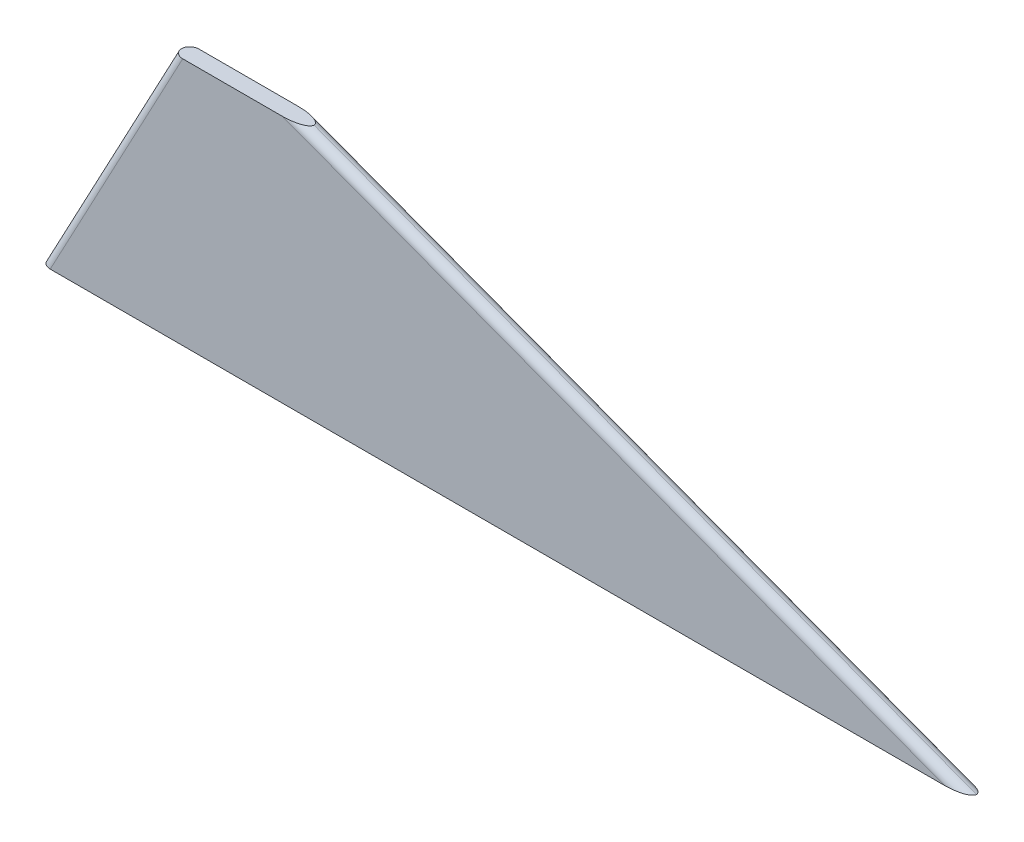
ISO-10303-21;
HEADER;
FILE_DESCRIPTION(('STEP AP214'),'2;1');
FILE_NAME('part.step','',(''),(''),'','','');
FILE_SCHEMA(('AUTOMOTIVE_DESIGN { 1 0 10303 214 1 1 1 1 }'));
ENDSEC;
DATA;
#1=APPLICATION_CONTEXT('core data for automotive mechanical design processes');
#2=APPLICATION_PROTOCOL_DEFINITION('international standard','automotive_design',2000,#1);
#3=PRODUCT_CONTEXT('',#1,'mechanical');
#4=PRODUCT('Part','Part','',(#3));
#5=PRODUCT_RELATED_PRODUCT_CATEGORY('part','',(#4));
#6=PRODUCT_DEFINITION_FORMATION('','',#4);
#7=PRODUCT_DEFINITION_CONTEXT('part definition',#1,'design');
#8=PRODUCT_DEFINITION('design','',#6,#7);
#9=PRODUCT_DEFINITION_SHAPE('','',#8);
#10=(LENGTH_UNIT() NAMED_UNIT(*) SI_UNIT(.MILLI.,.METRE.));
#11=(NAMED_UNIT(*) PLANE_ANGLE_UNIT() SI_UNIT($,.RADIAN.));
#12=(NAMED_UNIT(*) SI_UNIT($,.STERADIAN.) SOLID_ANGLE_UNIT());
#13=UNCERTAINTY_MEASURE_WITH_UNIT(LENGTH_MEASURE(1.E-05),#10,'distance_accuracy_value','');
#14=(GEOMETRIC_REPRESENTATION_CONTEXT(3) GLOBAL_UNCERTAINTY_ASSIGNED_CONTEXT((#13)) GLOBAL_UNIT_ASSIGNED_CONTEXT((#10,
#11,#12)) REPRESENTATION_CONTEXT('',''));
#15=CARTESIAN_POINT('',(0.,0.,0.));
#16=DIRECTION('',(0.,0.,1.));
#17=DIRECTION('',(1.,0.,0.));
#18=AXIS2_PLACEMENT_3D('',#15,#16,#17);
#19=CARTESIAN_POINT('',(-304.8,95.25,6.35));
#20=DIRECTION('',(0.,-1.,0.));
#21=DIRECTION('',(1.,0.,0.));
#22=AXIS2_PLACEMENT_3D('',#19,#20,#21);
#23=PLANE('',#22);
#24=CARTESIAN_POINT('',(-301.201666666667,95.25,3.175));
#25=DIRECTION('',(0.,-1.,0.));
#26=DIRECTION('',(-1.,0.,0.));
#27=AXIS2_PLACEMENT_3D('',#24,#25,#26);
#28=ELLIPSE('',#27,3.59833333333333,3.175);
#29=CARTESIAN_POINT('',(-301.201666666667,95.25,0.));
#30=VERTEX_POINT('',#29);
#31=CARTESIAN_POINT('',(-304.8,95.25,3.175));
#32=VERTEX_POINT('',#31);
#33=EDGE_CURVE('E57',#30,#32,#28,.F.);
#34=ORIENTED_EDGE('',*,*,#33,.T.);
#35=CARTESIAN_POINT('',(-301.201666666667,95.25,3.175));
#36=DIRECTION('',(0.,-1.,0.));
#37=DIRECTION('',(1.,0.,0.));
#38=AXIS2_PLACEMENT_3D('',#35,#36,#37);
#39=ELLIPSE('',#38,3.59833333333333,3.175);
#40=CARTESIAN_POINT('',(-301.201666666667,95.25,6.35));
#41=VERTEX_POINT('',#40);
#42=EDGE_CURVE('E106',#32,#41,#39,.F.);
#43=ORIENTED_EDGE('',*,*,#42,.T.);
#44=DIRECTION('',(-1.,0.,0.));
#45=VECTOR('',#44,1.);
#46=CARTESIAN_POINT('',(-304.8,95.25,6.35));
#47=LINE('',#46,#45);
#48=CARTESIAN_POINT('',(-263.042403963794,95.25,6.35));
#49=VERTEX_POINT('',#48);
#50=EDGE_CURVE('E99',#49,#41,#47,.T.);
#51=ORIENTED_EDGE('',*,*,#50,.F.);
#52=CARTESIAN_POINT('',(-263.042403963794,95.25,3.175));
#53=DIRECTION('',(0.,-1.,0.));
#54=DIRECTION('',(1.,0.,0.));
#55=AXIS2_PLACEMENT_3D('',#52,#53,#54);
#56=ELLIPSE('',#55,9.04240396379438,3.175);
#57=CARTESIAN_POINT('',(-254.,95.25,3.175));
#58=VERTEX_POINT('',#57);
#59=EDGE_CURVE('E50',#49,#58,#56,.F.);
#60=ORIENTED_EDGE('',*,*,#59,.T.);
#61=CARTESIAN_POINT('',(-263.042403963794,95.25,3.175));
#62=DIRECTION('',(0.,-1.,0.));
#63=DIRECTION('',(-1.,0.,0.));
#64=AXIS2_PLACEMENT_3D('',#61,#62,#63);
#65=ELLIPSE('',#64,9.04240396379438,3.175);
#66=CARTESIAN_POINT('',(-263.042403963794,95.25,0.));
#67=VERTEX_POINT('',#66);
#68=EDGE_CURVE('E92',#58,#67,#65,.F.);
#69=ORIENTED_EDGE('',*,*,#68,.T.);
#70=DIRECTION('',(-1.,0.,0.));
#71=VECTOR('',#70,1.);
#72=CARTESIAN_POINT('',(-304.8,95.25,0.));
#73=LINE('',#72,#71);
#74=EDGE_CURVE('E111',#67,#30,#73,.T.);
#75=ORIENTED_EDGE('',*,*,#74,.T.);
#76=EDGE_LOOP('',(#34,#43,#51,#60,#69,#75));
#77=FACE_BOUND('',#76,.T.);
#78=ADVANCED_FACE('F33',(#77),#23,.F.);
#79=CARTESIAN_POINT('',(0.,0.,6.35));
#80=DIRECTION('',(0.,1.,0.));
#81=DIRECTION('',(-1.,0.,0.));
#82=AXIS2_PLACEMENT_3D('',#79,#80,#81);
#83=PLANE('',#82);
#84=DIRECTION('',(1.,0.,0.));
#85=VECTOR('',#84,1.);
#86=CARTESIAN_POINT('',(0.,0.,6.35));
#87=LINE('',#86,#85);
#88=CARTESIAN_POINT('',(-352.001666666667,0.,6.35));
#89=VERTEX_POINT('',#88);
#90=CARTESIAN_POINT('',(-9.04240396379434,0.,6.35));
#91=VERTEX_POINT('',#90);
#92=EDGE_CURVE('E102',#89,#91,#87,.T.);
#93=ORIENTED_EDGE('',*,*,#92,.F.);
#94=CARTESIAN_POINT('',(-352.001666666667,0.,3.175));
#95=DIRECTION('',(0.,1.,0.));
#96=DIRECTION('',(1.,0.,0.));
#97=AXIS2_PLACEMENT_3D('',#94,#95,#96);
#98=ELLIPSE('',#97,3.59833333333333,3.175);
#99=CARTESIAN_POINT('',(-355.6,0.,3.175));
#100=VERTEX_POINT('',#99);
#101=EDGE_CURVE('E123',#89,#100,#98,.F.);
#102=ORIENTED_EDGE('',*,*,#101,.T.);
#103=CARTESIAN_POINT('',(-352.001666666667,0.,3.175));
#104=DIRECTION('',(0.,1.,0.));
#105=DIRECTION('',(-1.,0.,0.));
#106=AXIS2_PLACEMENT_3D('',#103,#104,#105);
#107=ELLIPSE('',#106,3.59833333333333,3.175);
#108=CARTESIAN_POINT('',(-352.001666666667,0.,0.));
#109=VERTEX_POINT('',#108);
#110=EDGE_CURVE('E121',#100,#109,#107,.F.);
#111=ORIENTED_EDGE('',*,*,#110,.T.);
#112=DIRECTION('',(1.,0.,0.));
#113=VECTOR('',#112,1.);
#114=CARTESIAN_POINT('',(0.,0.,0.));
#115=LINE('',#114,#113);
#116=CARTESIAN_POINT('',(-9.04240396379433,0.,0.));
#117=VERTEX_POINT('',#116);
#118=EDGE_CURVE('E107',#109,#117,#115,.T.);
#119=ORIENTED_EDGE('',*,*,#118,.T.);
#120=CARTESIAN_POINT('',(-9.04240396379433,0.,3.175));
#121=DIRECTION('',(0.,1.,0.));
#122=DIRECTION('',(-1.,0.,0.));
#123=AXIS2_PLACEMENT_3D('',#120,#121,#122);
#124=ELLIPSE('',#123,9.04240396379438,3.175);
#125=CARTESIAN_POINT('',(0.,0.,3.175));
#126=VERTEX_POINT('',#125);
#127=EDGE_CURVE('E117',#117,#126,#124,.F.);
#128=ORIENTED_EDGE('',*,*,#127,.T.);
#129=CARTESIAN_POINT('',(-9.04240396379438,0.,3.175));
#130=DIRECTION('',(0.,1.,0.));
#131=DIRECTION('',(1.,0.,0.));
#132=AXIS2_PLACEMENT_3D('',#129,#130,#131);
#133=ELLIPSE('',#132,9.04240396379438,3.175);
#134=EDGE_CURVE('E119',#126,#91,#133,.F.);
#135=ORIENTED_EDGE('',*,*,#134,.T.);
#136=EDGE_LOOP('',(#93,#102,#111,#119,#128,#135));
#137=FACE_BOUND('',#136,.T.);
#138=ADVANCED_FACE('F137',(#137),#83,.F.);
#139=CARTESIAN_POINT('',(0.,0.,6.35));
#140=DIRECTION('',(0.,0.,1.));
#141=DIRECTION('',(1.,0.,0.));
#142=AXIS2_PLACEMENT_3D('',#139,#140,#141);
#143=PLANE('',#142);
#144=ORIENTED_EDGE('',*,*,#50,.T.);
#145=DIRECTION('',(-0.470588235294118,-0.882352941176471,0.));
#146=VECTOR('',#145,1.);
#147=CARTESIAN_POINT('',(-352.798529411765,-1.4941176470589,6.35));
#148=LINE('',#147,#146);
#149=EDGE_CURVE('E103',#41,#89,#148,.T.);
#150=ORIENTED_EDGE('',*,*,#149,.T.);
#151=ORIENTED_EDGE('',*,*,#92,.T.);
#152=DIRECTION('',(-0.936329177569045,0.351123441588392,0.));
#153=VECTOR('',#152,1.);
#154=CARTESIAN_POINT('',(-255.114816927043,92.2771548612183,6.35));
#155=LINE('',#154,#153);
#156=EDGE_CURVE('E90',#91,#49,#155,.T.);
#157=ORIENTED_EDGE('',*,*,#156,.T.);
#158=EDGE_LOOP('',(#144,#150,#151,#157));
#159=FACE_BOUND('',#158,.T.);
#160=ADVANCED_FACE('F97',(#159),#143,.T.);
#161=CARTESIAN_POINT('',(0.,0.,0.));
#162=DIRECTION('',(0.,0.,1.));
#163=DIRECTION('',(1.,0.,0.));
#164=AXIS2_PLACEMENT_3D('',#161,#162,#163);
#165=PLANE('',#164);
#166=ORIENTED_EDGE('',*,*,#118,.F.);
#167=DIRECTION('',(-0.470588235294118,-0.882352941176471,0.));
#168=VECTOR('',#167,1.);
#169=CARTESIAN_POINT('',(-274.049740484429,146.159861591696,0.));
#170=LINE('',#169,#168);
#171=EDGE_CURVE('E11',#109,#30,#170,.F.);
#172=ORIENTED_EDGE('',*,*,#171,.T.);
#173=ORIENTED_EDGE('',*,*,#74,.F.);
#174=DIRECTION('',(-0.936329177569045,0.351123441588392,0.));
#175=VECTOR('',#174,1.);
#176=CARTESIAN_POINT('',(-1.11481692704314,-2.9728451387817,0.));
#177=LINE('',#176,#175);
#178=EDGE_CURVE('E42',#67,#117,#177,.F.);
#179=ORIENTED_EDGE('',*,*,#178,.T.);
#180=EDGE_LOOP('',(#166,#172,#173,#179));
#181=FACE_BOUND('',#180,.T.);
#182=ADVANCED_FACE('F140',(#181),#165,.F.);
#183=CARTESIAN_POINT('',(-352.798529411765,-1.49411764705887,3.175));
#184=DIRECTION('',(-0.470588235294118,-0.882352941176471,0.));
#185=DIRECTION('',(0.882352941176471,-0.470588235294118,0.));
#186=AXIS2_PLACEMENT_3D('',#183,#184,#185);
#187=CYLINDRICAL_SURFACE('',#186,3.175);
#188=DIRECTION('',(-0.470588235294118,-0.882352941176471,0.));
#189=VECTOR('',#188,1.);
#190=CARTESIAN_POINT('',(-355.6,0.,3.175));
#191=LINE('',#190,#189);
#192=EDGE_CURVE('E114',#32,#100,#191,.T.);
#193=ORIENTED_EDGE('',*,*,#192,.F.);
#194=ORIENTED_EDGE('',*,*,#33,.F.);
#195=ORIENTED_EDGE('',*,*,#171,.F.);
#196=ORIENTED_EDGE('',*,*,#110,.F.);
#197=EDGE_LOOP('',(#193,#194,#195,#196));
#198=FACE_BOUND('',#197,.T.);
#199=ADVANCED_FACE('F133',(#198),#187,.T.);
#200=CARTESIAN_POINT('',(-274.049740484429,146.159861591696,3.175));
#201=DIRECTION('',(0.470588235294118,0.882352941176471,0.));
#202=DIRECTION('',(-0.882352941176471,0.470588235294118,0.));
#203=AXIS2_PLACEMENT_3D('',#200,#201,#202);
#204=CYLINDRICAL_SURFACE('',#203,3.175);
#205=ORIENTED_EDGE('',*,*,#42,.F.);
#206=ORIENTED_EDGE('',*,*,#192,.T.);
#207=ORIENTED_EDGE('',*,*,#101,.F.);
#208=ORIENTED_EDGE('',*,*,#149,.F.);
#209=EDGE_LOOP('',(#205,#206,#207,#208));
#210=FACE_BOUND('',#209,.T.);
#211=ADVANCED_FACE('F130',(#210),#204,.T.);
#212=CARTESIAN_POINT('',(-255.114816927043,92.2771548612183,3.175));
#213=DIRECTION('',(-0.936329177569045,0.351123441588392,0.));
#214=DIRECTION('',(-0.351123441588392,-0.936329177569045,0.));
#215=AXIS2_PLACEMENT_3D('',#212,#213,#214);
#216=CYLINDRICAL_SURFACE('',#215,3.175);
#217=DIRECTION('',(-0.936329177569045,0.351123441588392,0.));
#218=VECTOR('',#217,1.);
#219=CARTESIAN_POINT('',(-254.,95.25,3.175));
#220=LINE('',#219,#218);
#221=EDGE_CURVE('E37',#126,#58,#220,.T.);
#222=ORIENTED_EDGE('',*,*,#221,.F.);
#223=ORIENTED_EDGE('',*,*,#127,.F.);
#224=ORIENTED_EDGE('',*,*,#178,.F.);
#225=ORIENTED_EDGE('',*,*,#68,.F.);
#226=EDGE_LOOP('',(#222,#223,#224,#225));
#227=FACE_BOUND('',#226,.T.);
#228=ADVANCED_FACE('F35',(#227),#216,.T.);
#229=CARTESIAN_POINT('',(-1.11481692704314,-2.97284513878171,3.175));
#230=DIRECTION('',(0.936329177569045,-0.351123441588392,0.));
#231=DIRECTION('',(0.351123441588392,0.936329177569045,0.));
#232=AXIS2_PLACEMENT_3D('',#229,#230,#231);
#233=CYLINDRICAL_SURFACE('',#232,3.175);
#234=ORIENTED_EDGE('',*,*,#134,.F.);
#235=ORIENTED_EDGE('',*,*,#221,.T.);
#236=ORIENTED_EDGE('',*,*,#59,.F.);
#237=ORIENTED_EDGE('',*,*,#156,.F.);
#238=EDGE_LOOP('',(#234,#235,#236,#237));
#239=FACE_BOUND('',#238,.T.);
#240=ADVANCED_FACE('F89',(#239),#233,.T.);
#241=CLOSED_SHELL('',(#78,#138,#160,#182,#199,#211,#228,#240));
#242=MANIFOLD_SOLID_BREP('B2',#241);
#243=ADVANCED_BREP_SHAPE_REPRESENTATION('',(#18,#242),#14);
#244=SHAPE_DEFINITION_REPRESENTATION(#9,#243);
ENDSEC;
END-ISO-10303-21;
